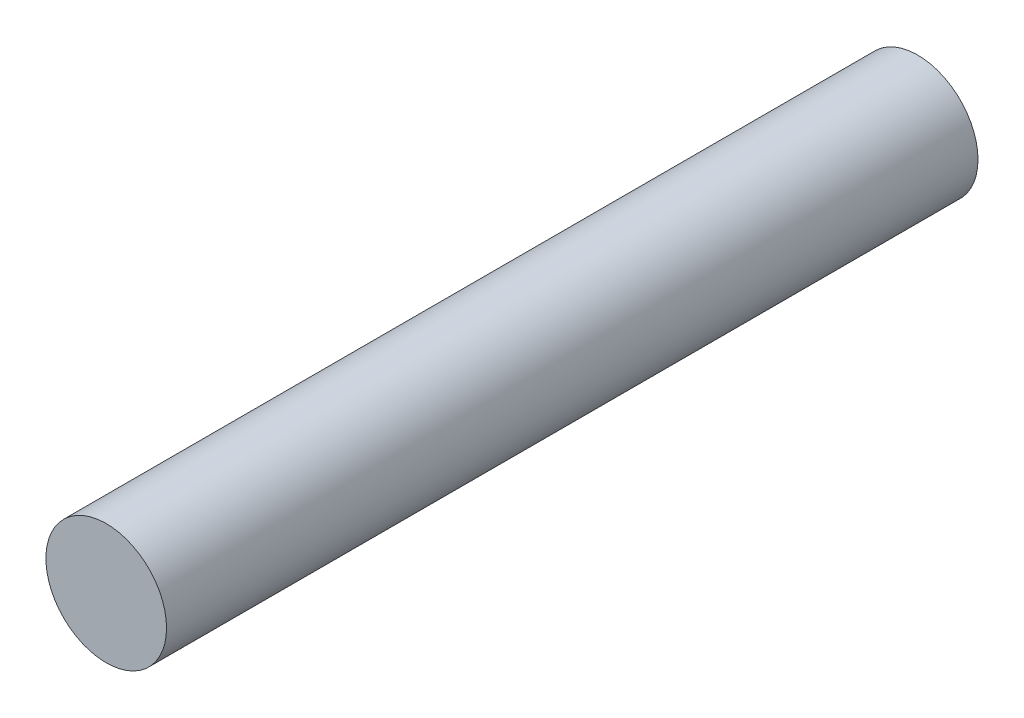
ISO-10303-21;
HEADER;
FILE_DESCRIPTION(('STEP AP214'),'2;1');
FILE_NAME('part.step','',(''),(''),'','','');
FILE_SCHEMA(('AUTOMOTIVE_DESIGN { 1 0 10303 214 1 1 1 1 }'));
ENDSEC;
DATA;
#1=APPLICATION_CONTEXT('core data for automotive mechanical design processes');
#2=APPLICATION_PROTOCOL_DEFINITION('international standard','automotive_design',2000,#1);
#3=PRODUCT_CONTEXT('',#1,'mechanical');
#4=PRODUCT('Part','Part','',(#3));
#5=PRODUCT_RELATED_PRODUCT_CATEGORY('part','',(#4));
#6=PRODUCT_DEFINITION_FORMATION('','',#4);
#7=PRODUCT_DEFINITION_CONTEXT('part definition',#1,'design');
#8=PRODUCT_DEFINITION('design','',#6,#7);
#9=PRODUCT_DEFINITION_SHAPE('','',#8);
#10=(LENGTH_UNIT() NAMED_UNIT(*) SI_UNIT(.MILLI.,.METRE.));
#11=(NAMED_UNIT(*) PLANE_ANGLE_UNIT() SI_UNIT($,.RADIAN.));
#12=(NAMED_UNIT(*) SI_UNIT($,.STERADIAN.) SOLID_ANGLE_UNIT());
#13=UNCERTAINTY_MEASURE_WITH_UNIT(LENGTH_MEASURE(1.E-05),#10,'distance_accuracy_value','');
#14=(GEOMETRIC_REPRESENTATION_CONTEXT(3) GLOBAL_UNCERTAINTY_ASSIGNED_CONTEXT((#13)) GLOBAL_UNIT_ASSIGNED_CONTEXT((#10,
#11,#12)) REPRESENTATION_CONTEXT('',''));
#15=CARTESIAN_POINT('',(0.,0.,0.));
#16=DIRECTION('',(0.,0.,1.));
#17=DIRECTION('',(1.,0.,0.));
#18=AXIS2_PLACEMENT_3D('',#15,#16,#17);
#19=CARTESIAN_POINT('',(0.,0.,84.07));
#20=DIRECTION('',(0.,0.,-1.));
#21=DIRECTION('',(-1.,0.,0.));
#22=AXIS2_PLACEMENT_3D('',#19,#20,#21);
#23=CYLINDRICAL_SURFACE('',#22,6.25);
#24=CARTESIAN_POINT('',(0.,0.,84.07));
#25=DIRECTION('',(0.,0.,1.));
#26=DIRECTION('',(1.,0.,0.));
#27=AXIS2_PLACEMENT_3D('',#24,#25,#26);
#28=CIRCLE('',#27,6.25);
#29=CARTESIAN_POINT('',(6.25,0.,84.07));
#30=VERTEX_POINT('',#29);
#31=EDGE_CURVE('E10',#30,#30,#28,.T.);
#32=ORIENTED_EDGE('',*,*,#31,.F.);
#33=EDGE_LOOP('',(#32));
#34=FACE_BOUND('',#33,.T.);
#35=CARTESIAN_POINT('',(0.,0.,0.));
#36=DIRECTION('',(0.,0.,1.));
#37=DIRECTION('',(1.,0.,0.));
#38=AXIS2_PLACEMENT_3D('',#35,#36,#37);
#39=CIRCLE('',#38,6.25);
#40=CARTESIAN_POINT('',(6.25,0.,0.));
#41=VERTEX_POINT('',#40);
#42=EDGE_CURVE('E40',#41,#41,#39,.T.);
#43=ORIENTED_EDGE('',*,*,#42,.T.);
#44=EDGE_LOOP('',(#43));
#45=FACE_BOUND('',#44,.T.);
#46=ADVANCED_FACE('F37',(#34,#45),#23,.T.);
#47=CARTESIAN_POINT('',(0.,0.,84.07));
#48=DIRECTION('',(0.,0.,1.));
#49=DIRECTION('',(1.,0.,0.));
#50=AXIS2_PLACEMENT_3D('',#47,#48,#49);
#51=PLANE('',#50);
#52=ORIENTED_EDGE('',*,*,#31,.T.);
#53=EDGE_LOOP('',(#52));
#54=FACE_BOUND('',#53,.T.);
#55=ADVANCED_FACE('F54',(#54),#51,.T.);
#56=CARTESIAN_POINT('',(0.,0.,0.));
#57=DIRECTION('',(0.,0.,1.));
#58=DIRECTION('',(1.,0.,0.));
#59=AXIS2_PLACEMENT_3D('',#56,#57,#58);
#60=PLANE('',#59);
#61=ORIENTED_EDGE('',*,*,#42,.F.);
#62=EDGE_LOOP('',(#61));
#63=FACE_BOUND('',#62,.T.);
#64=ADVANCED_FACE('F52',(#63),#60,.F.);
#65=CLOSED_SHELL('',(#46,#55,#64));
#66=MANIFOLD_SOLID_BREP('B2',#65);
#67=ADVANCED_BREP_SHAPE_REPRESENTATION('',(#18,#66),#14);
#68=SHAPE_DEFINITION_REPRESENTATION(#9,#67);
ENDSEC;
END-ISO-10303-21;
